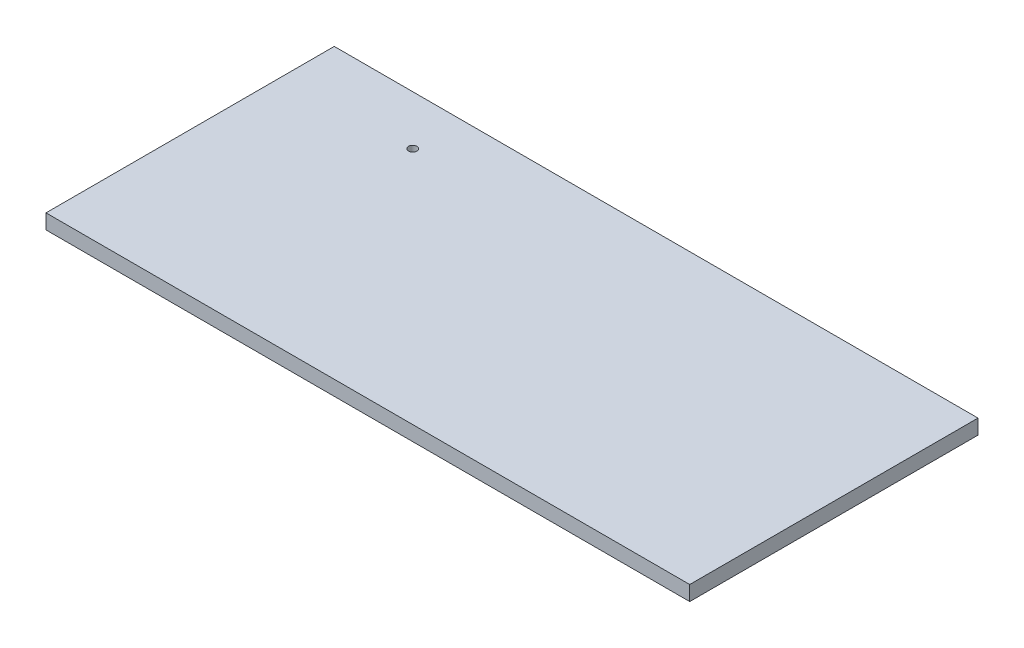
ISO-10303-21;
HEADER;
FILE_DESCRIPTION(('STEP AP214'),'2;1');
FILE_NAME('part.step','',(''),(''),'','','');
FILE_SCHEMA(('AUTOMOTIVE_DESIGN { 1 0 10303 214 1 1 1 1 }'));
ENDSEC;
DATA;
#1=APPLICATION_CONTEXT('core data for automotive mechanical design processes');
#2=APPLICATION_PROTOCOL_DEFINITION('international standard','automotive_design',2000,#1);
#3=PRODUCT_CONTEXT('',#1,'mechanical');
#4=PRODUCT('Part','Part','',(#3));
#5=PRODUCT_RELATED_PRODUCT_CATEGORY('part','',(#4));
#6=PRODUCT_DEFINITION_FORMATION('','',#4);
#7=PRODUCT_DEFINITION_CONTEXT('part definition',#1,'design');
#8=PRODUCT_DEFINITION('design','',#6,#7);
#9=PRODUCT_DEFINITION_SHAPE('','',#8);
#10=(LENGTH_UNIT() NAMED_UNIT(*) SI_UNIT(.MILLI.,.METRE.));
#11=(NAMED_UNIT(*) PLANE_ANGLE_UNIT() SI_UNIT($,.RADIAN.));
#12=(NAMED_UNIT(*) SI_UNIT($,.STERADIAN.) SOLID_ANGLE_UNIT());
#13=UNCERTAINTY_MEASURE_WITH_UNIT(LENGTH_MEASURE(1.E-05),#10,'distance_accuracy_value','');
#14=(GEOMETRIC_REPRESENTATION_CONTEXT(3) GLOBAL_UNCERTAINTY_ASSIGNED_CONTEXT((#13)) GLOBAL_UNIT_ASSIGNED_CONTEXT((#10,
#11,#12)) REPRESENTATION_CONTEXT('',''));
#15=CARTESIAN_POINT('',(0.,0.,0.));
#16=DIRECTION('',(0.,0.,1.));
#17=DIRECTION('',(1.,0.,0.));
#18=AXIS2_PLACEMENT_3D('',#15,#16,#17);
#19=CARTESIAN_POINT('',(0.,3.,0.));
#20=DIRECTION('',(1.,0.,0.));
#21=DIRECTION('',(0.,0.,-1.));
#22=AXIS2_PLACEMENT_3D('',#19,#20,#21);
#23=PLANE('',#22);
#24=DIRECTION('',(0.,0.,1.));
#25=VECTOR('',#24,1.);
#26=CARTESIAN_POINT('',(0.,0.,0.));
#27=LINE('',#26,#25);
#28=CARTESIAN_POINT('',(0.,0.,0.));
#29=VERTEX_POINT('',#28);
#30=CARTESIAN_POINT('',(0.,0.,58.4));
#31=VERTEX_POINT('',#30);
#32=EDGE_CURVE('E111',#29,#31,#27,.T.);
#33=ORIENTED_EDGE('',*,*,#32,.T.);
#34=DIRECTION('',(0.,-1.,0.));
#35=VECTOR('',#34,1.);
#36=CARTESIAN_POINT('',(0.,3.,58.4));
#37=LINE('',#36,#35);
#38=CARTESIAN_POINT('',(0.,3.,58.4));
#39=VERTEX_POINT('',#38);
#40=EDGE_CURVE('E11',#39,#31,#37,.T.);
#41=ORIENTED_EDGE('',*,*,#40,.F.);
#42=DIRECTION('',(0.,0.,1.));
#43=VECTOR('',#42,1.);
#44=CARTESIAN_POINT('',(0.,3.,0.));
#45=LINE('',#44,#43);
#46=CARTESIAN_POINT('',(0.,3.,0.));
#47=VERTEX_POINT('',#46);
#48=EDGE_CURVE('E95',#47,#39,#45,.T.);
#49=ORIENTED_EDGE('',*,*,#48,.F.);
#50=DIRECTION('',(0.,-1.,0.));
#51=VECTOR('',#50,1.);
#52=CARTESIAN_POINT('',(0.,3.,0.));
#53=LINE('',#52,#51);
#54=EDGE_CURVE('E107',#47,#29,#53,.T.);
#55=ORIENTED_EDGE('',*,*,#54,.T.);
#56=EDGE_LOOP('',(#33,#41,#49,#55));
#57=FACE_BOUND('',#56,.T.);
#58=ADVANCED_FACE('F43',(#57),#23,.F.);
#59=CARTESIAN_POINT('',(0.,3.,58.4));
#60=DIRECTION('',(0.,0.,-1.));
#61=DIRECTION('',(-1.,0.,0.));
#62=AXIS2_PLACEMENT_3D('',#59,#60,#61);
#63=PLANE('',#62);
#64=DIRECTION('',(1.,0.,0.));
#65=VECTOR('',#64,1.);
#66=CARTESIAN_POINT('',(0.,0.,58.4));
#67=LINE('',#66,#65);
#68=CARTESIAN_POINT('',(130.41,0.,58.4));
#69=VERTEX_POINT('',#68);
#70=EDGE_CURVE('E100',#31,#69,#67,.T.);
#71=ORIENTED_EDGE('',*,*,#70,.T.);
#72=DIRECTION('',(0.,-1.,0.));
#73=VECTOR('',#72,1.);
#74=CARTESIAN_POINT('',(130.41,3.,58.4));
#75=LINE('',#74,#73);
#76=CARTESIAN_POINT('',(130.41,3.,58.4));
#77=VERTEX_POINT('',#76);
#78=EDGE_CURVE('E52',#77,#69,#75,.T.);
#79=ORIENTED_EDGE('',*,*,#78,.F.);
#80=DIRECTION('',(1.,0.,0.));
#81=VECTOR('',#80,1.);
#82=CARTESIAN_POINT('',(0.,3.,58.4));
#83=LINE('',#82,#81);
#84=EDGE_CURVE('E90',#39,#77,#83,.T.);
#85=ORIENTED_EDGE('',*,*,#84,.F.);
#86=ORIENTED_EDGE('',*,*,#40,.T.);
#87=EDGE_LOOP('',(#71,#79,#85,#86));
#88=FACE_BOUND('',#87,.T.);
#89=ADVANCED_FACE('F99',(#88),#63,.F.);
#90=CARTESIAN_POINT('',(130.41,3.,0.));
#91=DIRECTION('',(-1.,0.,0.));
#92=DIRECTION('',(0.,0.,1.));
#93=AXIS2_PLACEMENT_3D('',#90,#91,#92);
#94=PLANE('',#93);
#95=DIRECTION('',(0.,0.,-1.));
#96=VECTOR('',#95,1.);
#97=CARTESIAN_POINT('',(130.41,0.,0.));
#98=LINE('',#97,#96);
#99=CARTESIAN_POINT('',(130.41,0.,0.));
#100=VERTEX_POINT('',#99);
#101=EDGE_CURVE('E77',#69,#100,#98,.T.);
#102=ORIENTED_EDGE('',*,*,#101,.T.);
#103=DIRECTION('',(0.,-1.,0.));
#104=VECTOR('',#103,1.);
#105=CARTESIAN_POINT('',(130.41,3.,0.));
#106=LINE('',#105,#104);
#107=CARTESIAN_POINT('',(130.41,3.,0.));
#108=VERTEX_POINT('',#107);
#109=EDGE_CURVE('E102',#108,#100,#106,.T.);
#110=ORIENTED_EDGE('',*,*,#109,.F.);
#111=DIRECTION('',(0.,0.,-1.));
#112=VECTOR('',#111,1.);
#113=CARTESIAN_POINT('',(130.41,3.,0.));
#114=LINE('',#113,#112);
#115=EDGE_CURVE('E93',#77,#108,#114,.T.);
#116=ORIENTED_EDGE('',*,*,#115,.F.);
#117=ORIENTED_EDGE('',*,*,#78,.T.);
#118=EDGE_LOOP('',(#102,#110,#116,#117));
#119=FACE_BOUND('',#118,.T.);
#120=ADVANCED_FACE('F103',(#119),#94,.F.);
#121=CARTESIAN_POINT('',(0.,3.,0.));
#122=DIRECTION('',(0.,0.,1.));
#123=DIRECTION('',(1.,0.,0.));
#124=AXIS2_PLACEMENT_3D('',#121,#122,#123);
#125=PLANE('',#124);
#126=DIRECTION('',(-1.,0.,0.));
#127=VECTOR('',#126,1.);
#128=CARTESIAN_POINT('',(0.,0.,0.));
#129=LINE('',#128,#127);
#130=EDGE_CURVE('E83',#100,#29,#129,.T.);
#131=ORIENTED_EDGE('',*,*,#130,.T.);
#132=ORIENTED_EDGE('',*,*,#54,.F.);
#133=DIRECTION('',(-1.,0.,0.));
#134=VECTOR('',#133,1.);
#135=CARTESIAN_POINT('',(0.,3.,0.));
#136=LINE('',#135,#134);
#137=EDGE_CURVE('E60',#108,#47,#136,.T.);
#138=ORIENTED_EDGE('',*,*,#137,.F.);
#139=ORIENTED_EDGE('',*,*,#109,.T.);
#140=EDGE_LOOP('',(#131,#132,#138,#139));
#141=FACE_BOUND('',#140,.T.);
#142=ADVANCED_FACE('F125',(#141),#125,.F.);
#143=CARTESIAN_POINT('',(0.,3.,0.));
#144=DIRECTION('',(0.,1.,0.));
#145=DIRECTION('',(0.,0.,1.));
#146=AXIS2_PLACEMENT_3D('',#143,#144,#145);
#147=PLANE('',#146);
#148=CARTESIAN_POINT('',(25.89,3.,10.));
#149=DIRECTION('',(0.,1.,0.));
#150=DIRECTION('',(0.,0.,1.));
#151=AXIS2_PLACEMENT_3D('',#148,#149,#150);
#152=CIRCLE('',#151,0.85);
#153=CARTESIAN_POINT('',(25.89,3.,10.85));
#154=VERTEX_POINT('',#153);
#155=EDGE_CURVE('E132',#154,#154,#152,.T.);
#156=ORIENTED_EDGE('',*,*,#155,.F.);
#157=EDGE_LOOP('',(#156));
#158=FACE_BOUND('',#157,.T.);
#159=ORIENTED_EDGE('',*,*,#48,.T.);
#160=ORIENTED_EDGE('',*,*,#84,.T.);
#161=ORIENTED_EDGE('',*,*,#115,.T.);
#162=ORIENTED_EDGE('',*,*,#137,.T.);
#163=EDGE_LOOP('',(#159,#160,#161,#162));
#164=FACE_BOUND('',#163,.T.);
#165=ADVANCED_FACE('F91',(#158,#164),#147,.T.);
#166=CARTESIAN_POINT('',(0.,0.,0.));
#167=DIRECTION('',(0.,1.,0.));
#168=DIRECTION('',(0.,0.,1.));
#169=AXIS2_PLACEMENT_3D('',#166,#167,#168);
#170=PLANE('',#169);
#171=CARTESIAN_POINT('',(25.89,0.,10.));
#172=DIRECTION('',(0.,1.,0.));
#173=DIRECTION('',(0.,0.,1.));
#174=AXIS2_PLACEMENT_3D('',#171,#172,#173);
#175=CIRCLE('',#174,0.85);
#176=CARTESIAN_POINT('',(25.89,0.,10.85));
#177=VERTEX_POINT('',#176);
#178=EDGE_CURVE('E115',#177,#177,#175,.T.);
#179=ORIENTED_EDGE('',*,*,#178,.T.);
#180=EDGE_LOOP('',(#179));
#181=FACE_BOUND('',#180,.T.);
#182=ORIENTED_EDGE('',*,*,#32,.F.);
#183=ORIENTED_EDGE('',*,*,#130,.F.);
#184=ORIENTED_EDGE('',*,*,#101,.F.);
#185=ORIENTED_EDGE('',*,*,#70,.F.);
#186=EDGE_LOOP('',(#182,#183,#184,#185));
#187=FACE_BOUND('',#186,.T.);
#188=ADVANCED_FACE('F128',(#181,#187),#170,.F.);
#189=CARTESIAN_POINT('',(25.89,0.,10.));
#190=DIRECTION('',(0.,1.,0.));
#191=DIRECTION('',(0.,0.,1.));
#192=AXIS2_PLACEMENT_3D('',#189,#190,#191);
#193=CYLINDRICAL_SURFACE('',#192,0.85);
#194=ORIENTED_EDGE('',*,*,#178,.F.);
#195=EDGE_LOOP('',(#194));
#196=FACE_BOUND('',#195,.T.);
#197=ORIENTED_EDGE('',*,*,#155,.T.);
#198=EDGE_LOOP('',(#197));
#199=FACE_BOUND('',#198,.T.);
#200=ADVANCED_FACE('F141',(#196,#199),#193,.F.);
#201=CLOSED_SHELL('',(#58,#89,#120,#142,#165,#188,#200));
#202=MANIFOLD_SOLID_BREP('B2',#201);
#203=ADVANCED_BREP_SHAPE_REPRESENTATION('',(#18,#202),#14);
#204=SHAPE_DEFINITION_REPRESENTATION(#9,#203);
ENDSEC;
END-ISO-10303-21;
